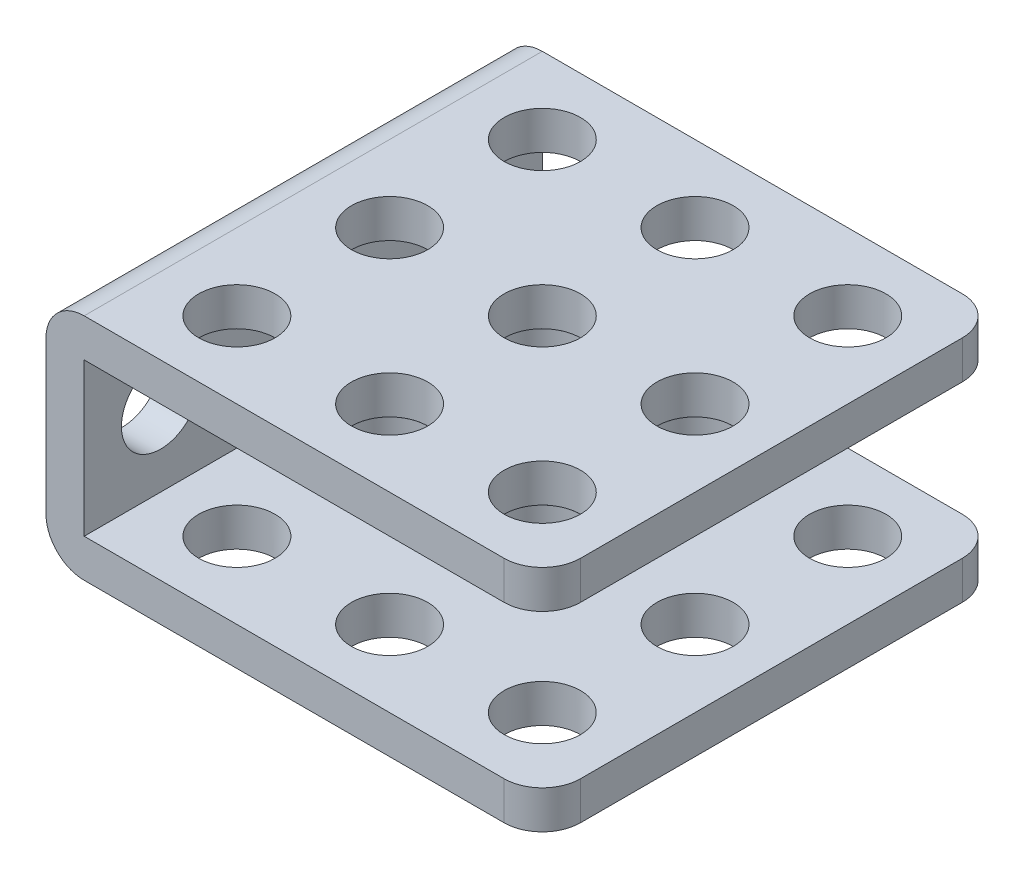
ISO-10303-21;
HEADER;
FILE_DESCRIPTION(('STEP AP214'),'2;1');
FILE_NAME('part.step','',(''),(''),'','','');
FILE_SCHEMA(('AUTOMOTIVE_DESIGN { 1 0 10303 214 1 1 1 1 }'));
ENDSEC;
DATA;
#1=APPLICATION_CONTEXT('core data for automotive mechanical design processes');
#2=APPLICATION_PROTOCOL_DEFINITION('international standard','automotive_design',2000,#1);
#3=PRODUCT_CONTEXT('',#1,'mechanical');
#4=PRODUCT('Part','Part','',(#3));
#5=PRODUCT_RELATED_PRODUCT_CATEGORY('part','',(#4));
#6=PRODUCT_DEFINITION_FORMATION('','',#4);
#7=PRODUCT_DEFINITION_CONTEXT('part definition',#1,'design');
#8=PRODUCT_DEFINITION('design','',#6,#7);
#9=PRODUCT_DEFINITION_SHAPE('','',#8);
#10=(LENGTH_UNIT() NAMED_UNIT(*) SI_UNIT(.MILLI.,.METRE.));
#11=(NAMED_UNIT(*) PLANE_ANGLE_UNIT() SI_UNIT($,.RADIAN.));
#12=(NAMED_UNIT(*) SI_UNIT($,.STERADIAN.) SOLID_ANGLE_UNIT());
#13=UNCERTAINTY_MEASURE_WITH_UNIT(LENGTH_MEASURE(1.E-05),#10,'distance_accuracy_value','');
#14=(GEOMETRIC_REPRESENTATION_CONTEXT(3) GLOBAL_UNCERTAINTY_ASSIGNED_CONTEXT((#13)) GLOBAL_UNIT_ASSIGNED_CONTEXT((#10,
#11,#12)) REPRESENTATION_CONTEXT('',''));
#15=CARTESIAN_POINT('',(0.,0.,0.));
#16=DIRECTION('',(0.,0.,1.));
#17=DIRECTION('',(1.,0.,0.));
#18=AXIS2_PLACEMENT_3D('',#15,#16,#17);
#19=CARTESIAN_POINT('',(6.,0.,20.));
#20=DIRECTION('',(0.,1.,0.));
#21=DIRECTION('',(0.,0.,1.));
#22=AXIS2_PLACEMENT_3D('',#19,#20,#21);
#23=CYLINDRICAL_SURFACE('',#22,2.);
#24=CARTESIAN_POINT('',(6.,12.,20.));
#25=DIRECTION('',(0.,1.,0.));
#26=DIRECTION('',(0.,0.,1.));
#27=AXIS2_PLACEMENT_3D('',#24,#25,#26);
#28=CIRCLE('',#27,2.);
#29=CARTESIAN_POINT('',(6.,12.,22.));
#30=VERTEX_POINT('',#29);
#31=EDGE_CURVE('E280',#30,#30,#28,.T.);
#32=ORIENTED_EDGE('',*,*,#31,.T.);
#33=EDGE_LOOP('',(#32));
#34=FACE_BOUND('',#33,.T.);
#35=CARTESIAN_POINT('',(6.,10.,20.));
#36=DIRECTION('',(0.,1.,0.));
#37=DIRECTION('',(0.,0.,1.));
#38=AXIS2_PLACEMENT_3D('',#35,#36,#37);
#39=CIRCLE('',#38,2.);
#40=CARTESIAN_POINT('',(6.,10.,22.));
#41=VERTEX_POINT('',#40);
#42=EDGE_CURVE('E283',#41,#41,#39,.T.);
#43=ORIENTED_EDGE('',*,*,#42,.F.);
#44=EDGE_LOOP('',(#43));
#45=FACE_BOUND('',#44,.T.);
#46=ADVANCED_FACE('F32',(#34,#45),#23,.F.);
#47=CARTESIAN_POINT('',(6.,0.,12.));
#48=DIRECTION('',(0.,1.,0.));
#49=DIRECTION('',(0.,0.,1.));
#50=AXIS2_PLACEMENT_3D('',#47,#48,#49);
#51=CYLINDRICAL_SURFACE('',#50,2.);
#52=CARTESIAN_POINT('',(6.,12.,12.));
#53=DIRECTION('',(0.,1.,0.));
#54=DIRECTION('',(0.,0.,1.));
#55=AXIS2_PLACEMENT_3D('',#52,#53,#54);
#56=CIRCLE('',#55,2.);
#57=CARTESIAN_POINT('',(6.,12.,14.));
#58=VERTEX_POINT('',#57);
#59=EDGE_CURVE('E274',#58,#58,#56,.T.);
#60=ORIENTED_EDGE('',*,*,#59,.T.);
#61=EDGE_LOOP('',(#60));
#62=FACE_BOUND('',#61,.T.);
#63=CARTESIAN_POINT('',(6.,10.,12.));
#64=DIRECTION('',(0.,1.,0.));
#65=DIRECTION('',(0.,0.,1.));
#66=AXIS2_PLACEMENT_3D('',#63,#64,#65);
#67=CIRCLE('',#66,2.);
#68=CARTESIAN_POINT('',(6.,10.,14.));
#69=VERTEX_POINT('',#68);
#70=EDGE_CURVE('E277',#69,#69,#67,.T.);
#71=ORIENTED_EDGE('',*,*,#70,.F.);
#72=EDGE_LOOP('',(#71));
#73=FACE_BOUND('',#72,.T.);
#74=ADVANCED_FACE('F424',(#62,#73),#51,.F.);
#75=CARTESIAN_POINT('',(6.,0.,4.));
#76=DIRECTION('',(0.,1.,0.));
#77=DIRECTION('',(0.,0.,1.));
#78=AXIS2_PLACEMENT_3D('',#75,#76,#77);
#79=CYLINDRICAL_SURFACE('',#78,2.);
#80=CARTESIAN_POINT('',(6.,12.,4.));
#81=DIRECTION('',(0.,1.,0.));
#82=DIRECTION('',(0.,0.,1.));
#83=AXIS2_PLACEMENT_3D('',#80,#81,#82);
#84=CIRCLE('',#83,2.);
#85=CARTESIAN_POINT('',(6.,12.,6.));
#86=VERTEX_POINT('',#85);
#87=EDGE_CURVE('E268',#86,#86,#84,.T.);
#88=ORIENTED_EDGE('',*,*,#87,.T.);
#89=EDGE_LOOP('',(#88));
#90=FACE_BOUND('',#89,.T.);
#91=CARTESIAN_POINT('',(6.,10.,4.));
#92=DIRECTION('',(0.,1.,0.));
#93=DIRECTION('',(0.,0.,1.));
#94=AXIS2_PLACEMENT_3D('',#91,#92,#93);
#95=CIRCLE('',#94,2.);
#96=CARTESIAN_POINT('',(6.,10.,6.));
#97=VERTEX_POINT('',#96);
#98=EDGE_CURVE('E271',#97,#97,#95,.T.);
#99=ORIENTED_EDGE('',*,*,#98,.F.);
#100=EDGE_LOOP('',(#99));
#101=FACE_BOUND('',#100,.T.);
#102=ADVANCED_FACE('F497',(#90,#101),#79,.F.);
#103=CARTESIAN_POINT('',(14.,0.,20.));
#104=DIRECTION('',(0.,1.,0.));
#105=DIRECTION('',(0.,0.,1.));
#106=AXIS2_PLACEMENT_3D('',#103,#104,#105);
#107=CYLINDRICAL_SURFACE('',#106,2.);
#108=CARTESIAN_POINT('',(14.,12.,20.));
#109=DIRECTION('',(0.,1.,0.));
#110=DIRECTION('',(0.,0.,1.));
#111=AXIS2_PLACEMENT_3D('',#108,#109,#110);
#112=CIRCLE('',#111,2.);
#113=CARTESIAN_POINT('',(14.,12.,22.));
#114=VERTEX_POINT('',#113);
#115=EDGE_CURVE('E262',#114,#114,#112,.T.);
#116=ORIENTED_EDGE('',*,*,#115,.T.);
#117=EDGE_LOOP('',(#116));
#118=FACE_BOUND('',#117,.T.);
#119=CARTESIAN_POINT('',(14.,10.,20.));
#120=DIRECTION('',(0.,1.,0.));
#121=DIRECTION('',(0.,0.,1.));
#122=AXIS2_PLACEMENT_3D('',#119,#120,#121);
#123=CIRCLE('',#122,2.);
#124=CARTESIAN_POINT('',(14.,10.,22.));
#125=VERTEX_POINT('',#124);
#126=EDGE_CURVE('E265',#125,#125,#123,.T.);
#127=ORIENTED_EDGE('',*,*,#126,.F.);
#128=EDGE_LOOP('',(#127));
#129=FACE_BOUND('',#128,.T.);
#130=ADVANCED_FACE('F493',(#118,#129),#107,.F.);
#131=CARTESIAN_POINT('',(14.,0.,12.));
#132=DIRECTION('',(0.,1.,0.));
#133=DIRECTION('',(0.,0.,1.));
#134=AXIS2_PLACEMENT_3D('',#131,#132,#133);
#135=CYLINDRICAL_SURFACE('',#134,2.);
#136=CARTESIAN_POINT('',(14.,12.,12.));
#137=DIRECTION('',(0.,1.,0.));
#138=DIRECTION('',(0.,0.,1.));
#139=AXIS2_PLACEMENT_3D('',#136,#137,#138);
#140=CIRCLE('',#139,2.);
#141=CARTESIAN_POINT('',(14.,12.,14.));
#142=VERTEX_POINT('',#141);
#143=EDGE_CURVE('E256',#142,#142,#140,.T.);
#144=ORIENTED_EDGE('',*,*,#143,.T.);
#145=EDGE_LOOP('',(#144));
#146=FACE_BOUND('',#145,.T.);
#147=CARTESIAN_POINT('',(14.,10.,12.));
#148=DIRECTION('',(0.,1.,0.));
#149=DIRECTION('',(0.,0.,1.));
#150=AXIS2_PLACEMENT_3D('',#147,#148,#149);
#151=CIRCLE('',#150,2.);
#152=CARTESIAN_POINT('',(14.,10.,14.));
#153=VERTEX_POINT('',#152);
#154=EDGE_CURVE('E259',#153,#153,#151,.T.);
#155=ORIENTED_EDGE('',*,*,#154,.F.);
#156=EDGE_LOOP('',(#155));
#157=FACE_BOUND('',#156,.T.);
#158=ADVANCED_FACE('F489',(#146,#157),#135,.F.);
#159=CARTESIAN_POINT('',(14.,0.,4.));
#160=DIRECTION('',(0.,1.,0.));
#161=DIRECTION('',(0.,0.,1.));
#162=AXIS2_PLACEMENT_3D('',#159,#160,#161);
#163=CYLINDRICAL_SURFACE('',#162,2.);
#164=CARTESIAN_POINT('',(14.,12.,4.));
#165=DIRECTION('',(0.,1.,0.));
#166=DIRECTION('',(0.,0.,1.));
#167=AXIS2_PLACEMENT_3D('',#164,#165,#166);
#168=CIRCLE('',#167,2.);
#169=CARTESIAN_POINT('',(14.,12.,6.));
#170=VERTEX_POINT('',#169);
#171=EDGE_CURVE('E250',#170,#170,#168,.T.);
#172=ORIENTED_EDGE('',*,*,#171,.T.);
#173=EDGE_LOOP('',(#172));
#174=FACE_BOUND('',#173,.T.);
#175=CARTESIAN_POINT('',(14.,10.,4.));
#176=DIRECTION('',(0.,1.,0.));
#177=DIRECTION('',(0.,0.,1.));
#178=AXIS2_PLACEMENT_3D('',#175,#176,#177);
#179=CIRCLE('',#178,2.);
#180=CARTESIAN_POINT('',(14.,10.,6.));
#181=VERTEX_POINT('',#180);
#182=EDGE_CURVE('E253',#181,#181,#179,.T.);
#183=ORIENTED_EDGE('',*,*,#182,.F.);
#184=EDGE_LOOP('',(#183));
#185=FACE_BOUND('',#184,.T.);
#186=ADVANCED_FACE('F485',(#174,#185),#163,.F.);
#187=CARTESIAN_POINT('',(22.,0.,20.));
#188=DIRECTION('',(0.,1.,0.));
#189=DIRECTION('',(0.,0.,1.));
#190=AXIS2_PLACEMENT_3D('',#187,#188,#189);
#191=CYLINDRICAL_SURFACE('',#190,2.);
#192=CARTESIAN_POINT('',(22.,12.,20.));
#193=DIRECTION('',(0.,1.,0.));
#194=DIRECTION('',(0.,0.,1.));
#195=AXIS2_PLACEMENT_3D('',#192,#193,#194);
#196=CIRCLE('',#195,2.);
#197=CARTESIAN_POINT('',(22.,12.,22.));
#198=VERTEX_POINT('',#197);
#199=EDGE_CURVE('E244',#198,#198,#196,.T.);
#200=ORIENTED_EDGE('',*,*,#199,.T.);
#201=EDGE_LOOP('',(#200));
#202=FACE_BOUND('',#201,.T.);
#203=CARTESIAN_POINT('',(22.,10.,20.));
#204=DIRECTION('',(0.,1.,0.));
#205=DIRECTION('',(0.,0.,1.));
#206=AXIS2_PLACEMENT_3D('',#203,#204,#205);
#207=CIRCLE('',#206,2.);
#208=CARTESIAN_POINT('',(22.,10.,22.));
#209=VERTEX_POINT('',#208);
#210=EDGE_CURVE('E247',#209,#209,#207,.T.);
#211=ORIENTED_EDGE('',*,*,#210,.F.);
#212=EDGE_LOOP('',(#211));
#213=FACE_BOUND('',#212,.T.);
#214=ADVANCED_FACE('F481',(#202,#213),#191,.F.);
#215=CARTESIAN_POINT('',(6.,0.,20.));
#216=DIRECTION('',(0.,1.,0.));
#217=DIRECTION('',(0.,0.,1.));
#218=AXIS2_PLACEMENT_3D('',#215,#216,#217);
#219=CYLINDRICAL_SURFACE('',#218,2.);
#220=CARTESIAN_POINT('',(6.,0.,20.));
#221=DIRECTION('',(0.,1.,0.));
#222=DIRECTION('',(0.,0.,1.));
#223=AXIS2_PLACEMENT_3D('',#220,#221,#222);
#224=CIRCLE('',#223,2.);
#225=CARTESIAN_POINT('',(6.,0.,22.));
#226=VERTEX_POINT('',#225);
#227=EDGE_CURVE('E238',#226,#226,#224,.T.);
#228=ORIENTED_EDGE('',*,*,#227,.F.);
#229=EDGE_LOOP('',(#228));
#230=FACE_BOUND('',#229,.T.);
#231=CARTESIAN_POINT('',(6.,2.,20.));
#232=DIRECTION('',(0.,-1.,0.));
#233=DIRECTION('',(0.,0.,-1.));
#234=AXIS2_PLACEMENT_3D('',#231,#232,#233);
#235=CIRCLE('',#234,2.);
#236=CARTESIAN_POINT('',(6.,2.,18.));
#237=VERTEX_POINT('',#236);
#238=EDGE_CURVE('E241',#237,#237,#235,.T.);
#239=ORIENTED_EDGE('',*,*,#238,.F.);
#240=EDGE_LOOP('',(#239));
#241=FACE_BOUND('',#240,.T.);
#242=ADVANCED_FACE('F477',(#230,#241),#219,.F.);
#243=CARTESIAN_POINT('',(6.,0.,12.));
#244=DIRECTION('',(0.,1.,0.));
#245=DIRECTION('',(0.,0.,1.));
#246=AXIS2_PLACEMENT_3D('',#243,#244,#245);
#247=CYLINDRICAL_SURFACE('',#246,2.);
#248=CARTESIAN_POINT('',(6.,0.,12.));
#249=DIRECTION('',(0.,1.,0.));
#250=DIRECTION('',(0.,0.,1.));
#251=AXIS2_PLACEMENT_3D('',#248,#249,#250);
#252=CIRCLE('',#251,2.);
#253=CARTESIAN_POINT('',(6.,0.,14.));
#254=VERTEX_POINT('',#253);
#255=EDGE_CURVE('E232',#254,#254,#252,.T.);
#256=ORIENTED_EDGE('',*,*,#255,.F.);
#257=EDGE_LOOP('',(#256));
#258=FACE_BOUND('',#257,.T.);
#259=CARTESIAN_POINT('',(6.,2.,12.));
#260=DIRECTION('',(0.,-1.,0.));
#261=DIRECTION('',(0.,0.,-1.));
#262=AXIS2_PLACEMENT_3D('',#259,#260,#261);
#263=CIRCLE('',#262,2.);
#264=CARTESIAN_POINT('',(6.,2.,10.));
#265=VERTEX_POINT('',#264);
#266=EDGE_CURVE('E235',#265,#265,#263,.T.);
#267=ORIENTED_EDGE('',*,*,#266,.F.);
#268=EDGE_LOOP('',(#267));
#269=FACE_BOUND('',#268,.T.);
#270=ADVANCED_FACE('F473',(#258,#269),#247,.F.);
#271=CARTESIAN_POINT('',(6.,0.,4.));
#272=DIRECTION('',(0.,1.,0.));
#273=DIRECTION('',(0.,0.,1.));
#274=AXIS2_PLACEMENT_3D('',#271,#272,#273);
#275=CYLINDRICAL_SURFACE('',#274,2.);
#276=CARTESIAN_POINT('',(6.,0.,4.));
#277=DIRECTION('',(0.,1.,0.));
#278=DIRECTION('',(0.,0.,1.));
#279=AXIS2_PLACEMENT_3D('',#276,#277,#278);
#280=CIRCLE('',#279,2.);
#281=CARTESIAN_POINT('',(6.,0.,6.));
#282=VERTEX_POINT('',#281);
#283=EDGE_CURVE('E226',#282,#282,#280,.T.);
#284=ORIENTED_EDGE('',*,*,#283,.F.);
#285=EDGE_LOOP('',(#284));
#286=FACE_BOUND('',#285,.T.);
#287=CARTESIAN_POINT('',(6.,2.,4.));
#288=DIRECTION('',(0.,-1.,0.));
#289=DIRECTION('',(0.,0.,-1.));
#290=AXIS2_PLACEMENT_3D('',#287,#288,#289);
#291=CIRCLE('',#290,2.);
#292=CARTESIAN_POINT('',(6.,2.,2.));
#293=VERTEX_POINT('',#292);
#294=EDGE_CURVE('E229',#293,#293,#291,.T.);
#295=ORIENTED_EDGE('',*,*,#294,.F.);
#296=EDGE_LOOP('',(#295));
#297=FACE_BOUND('',#296,.T.);
#298=ADVANCED_FACE('F469',(#286,#297),#275,.F.);
#299=CARTESIAN_POINT('',(14.,0.,20.));
#300=DIRECTION('',(0.,1.,0.));
#301=DIRECTION('',(0.,0.,1.));
#302=AXIS2_PLACEMENT_3D('',#299,#300,#301);
#303=CYLINDRICAL_SURFACE('',#302,2.);
#304=CARTESIAN_POINT('',(14.,0.,20.));
#305=DIRECTION('',(0.,1.,0.));
#306=DIRECTION('',(0.,0.,1.));
#307=AXIS2_PLACEMENT_3D('',#304,#305,#306);
#308=CIRCLE('',#307,2.);
#309=CARTESIAN_POINT('',(14.,0.,22.));
#310=VERTEX_POINT('',#309);
#311=EDGE_CURVE('E220',#310,#310,#308,.T.);
#312=ORIENTED_EDGE('',*,*,#311,.F.);
#313=EDGE_LOOP('',(#312));
#314=FACE_BOUND('',#313,.T.);
#315=CARTESIAN_POINT('',(14.,2.,20.));
#316=DIRECTION('',(0.,-1.,0.));
#317=DIRECTION('',(0.,0.,-1.));
#318=AXIS2_PLACEMENT_3D('',#315,#316,#317);
#319=CIRCLE('',#318,2.);
#320=CARTESIAN_POINT('',(14.,2.,18.));
#321=VERTEX_POINT('',#320);
#322=EDGE_CURVE('E223',#321,#321,#319,.T.);
#323=ORIENTED_EDGE('',*,*,#322,.F.);
#324=EDGE_LOOP('',(#323));
#325=FACE_BOUND('',#324,.T.);
#326=ADVANCED_FACE('F465',(#314,#325),#303,.F.);
#327=CARTESIAN_POINT('',(14.,0.,12.));
#328=DIRECTION('',(0.,1.,0.));
#329=DIRECTION('',(0.,0.,1.));
#330=AXIS2_PLACEMENT_3D('',#327,#328,#329);
#331=CYLINDRICAL_SURFACE('',#330,2.);
#332=CARTESIAN_POINT('',(14.,0.,12.));
#333=DIRECTION('',(0.,1.,0.));
#334=DIRECTION('',(0.,0.,1.));
#335=AXIS2_PLACEMENT_3D('',#332,#333,#334);
#336=CIRCLE('',#335,2.);
#337=CARTESIAN_POINT('',(14.,0.,14.));
#338=VERTEX_POINT('',#337);
#339=EDGE_CURVE('E214',#338,#338,#336,.T.);
#340=ORIENTED_EDGE('',*,*,#339,.F.);
#341=EDGE_LOOP('',(#340));
#342=FACE_BOUND('',#341,.T.);
#343=CARTESIAN_POINT('',(14.,2.,12.));
#344=DIRECTION('',(0.,-1.,0.));
#345=DIRECTION('',(0.,0.,-1.));
#346=AXIS2_PLACEMENT_3D('',#343,#344,#345);
#347=CIRCLE('',#346,2.);
#348=CARTESIAN_POINT('',(14.,2.,10.));
#349=VERTEX_POINT('',#348);
#350=EDGE_CURVE('E217',#349,#349,#347,.T.);
#351=ORIENTED_EDGE('',*,*,#350,.F.);
#352=EDGE_LOOP('',(#351));
#353=FACE_BOUND('',#352,.T.);
#354=ADVANCED_FACE('F461',(#342,#353),#331,.F.);
#355=CARTESIAN_POINT('',(14.,0.,4.));
#356=DIRECTION('',(0.,1.,0.));
#357=DIRECTION('',(0.,0.,1.));
#358=AXIS2_PLACEMENT_3D('',#355,#356,#357);
#359=CYLINDRICAL_SURFACE('',#358,2.);
#360=CARTESIAN_POINT('',(14.,0.,4.));
#361=DIRECTION('',(0.,1.,0.));
#362=DIRECTION('',(0.,0.,1.));
#363=AXIS2_PLACEMENT_3D('',#360,#361,#362);
#364=CIRCLE('',#363,2.);
#365=CARTESIAN_POINT('',(14.,0.,6.));
#366=VERTEX_POINT('',#365);
#367=EDGE_CURVE('E208',#366,#366,#364,.T.);
#368=ORIENTED_EDGE('',*,*,#367,.F.);
#369=EDGE_LOOP('',(#368));
#370=FACE_BOUND('',#369,.T.);
#371=CARTESIAN_POINT('',(14.,2.,4.));
#372=DIRECTION('',(0.,-1.,0.));
#373=DIRECTION('',(0.,0.,-1.));
#374=AXIS2_PLACEMENT_3D('',#371,#372,#373);
#375=CIRCLE('',#374,2.);
#376=CARTESIAN_POINT('',(14.,2.,2.));
#377=VERTEX_POINT('',#376);
#378=EDGE_CURVE('E211',#377,#377,#375,.T.);
#379=ORIENTED_EDGE('',*,*,#378,.F.);
#380=EDGE_LOOP('',(#379));
#381=FACE_BOUND('',#380,.T.);
#382=ADVANCED_FACE('F457',(#370,#381),#359,.F.);
#383=CARTESIAN_POINT('',(22.,0.,20.));
#384=DIRECTION('',(0.,1.,0.));
#385=DIRECTION('',(0.,0.,1.));
#386=AXIS2_PLACEMENT_3D('',#383,#384,#385);
#387=CYLINDRICAL_SURFACE('',#386,2.);
#388=CARTESIAN_POINT('',(22.,0.,20.));
#389=DIRECTION('',(0.,1.,0.));
#390=DIRECTION('',(0.,0.,1.));
#391=AXIS2_PLACEMENT_3D('',#388,#389,#390);
#392=CIRCLE('',#391,2.);
#393=CARTESIAN_POINT('',(22.,0.,22.));
#394=VERTEX_POINT('',#393);
#395=EDGE_CURVE('E202',#394,#394,#392,.T.);
#396=ORIENTED_EDGE('',*,*,#395,.F.);
#397=EDGE_LOOP('',(#396));
#398=FACE_BOUND('',#397,.T.);
#399=CARTESIAN_POINT('',(22.,2.,20.));
#400=DIRECTION('',(0.,-1.,0.));
#401=DIRECTION('',(0.,0.,-1.));
#402=AXIS2_PLACEMENT_3D('',#399,#400,#401);
#403=CIRCLE('',#402,2.);
#404=CARTESIAN_POINT('',(22.,2.,18.));
#405=VERTEX_POINT('',#404);
#406=EDGE_CURVE('E205',#405,#405,#403,.T.);
#407=ORIENTED_EDGE('',*,*,#406,.F.);
#408=EDGE_LOOP('',(#407));
#409=FACE_BOUND('',#408,.T.);
#410=ADVANCED_FACE('F453',(#398,#409),#387,.F.);
#411=CARTESIAN_POINT('',(0.,6.,4.));
#412=DIRECTION('',(1.,0.,0.));
#413=DIRECTION('',(0.,1.,0.));
#414=AXIS2_PLACEMENT_3D('',#411,#412,#413);
#415=CYLINDRICAL_SURFACE('',#414,2.05);
#416=CARTESIAN_POINT('',(0.,6.,4.));
#417=DIRECTION('',(1.,0.,0.));
#418=DIRECTION('',(0.,1.,0.));
#419=AXIS2_PLACEMENT_3D('',#416,#417,#418);
#420=CIRCLE('',#419,2.05);
#421=CARTESIAN_POINT('',(0.,8.05,4.));
#422=VERTEX_POINT('',#421);
#423=EDGE_CURVE('E196',#422,#422,#420,.T.);
#424=ORIENTED_EDGE('',*,*,#423,.F.);
#425=EDGE_LOOP('',(#424));
#426=FACE_BOUND('',#425,.T.);
#427=CARTESIAN_POINT('',(2.,6.,4.));
#428=DIRECTION('',(1.,0.,0.));
#429=DIRECTION('',(0.,1.,0.));
#430=AXIS2_PLACEMENT_3D('',#427,#428,#429);
#431=CIRCLE('',#430,2.05);
#432=CARTESIAN_POINT('',(2.,8.05,4.));
#433=VERTEX_POINT('',#432);
#434=EDGE_CURVE('E199',#433,#433,#431,.T.);
#435=ORIENTED_EDGE('',*,*,#434,.T.);
#436=EDGE_LOOP('',(#435));
#437=FACE_BOUND('',#436,.T.);
#438=ADVANCED_FACE('F449',(#426,#437),#415,.F.);
#439=CARTESIAN_POINT('',(26.,0.,24.));
#440=DIRECTION('',(0.,1.,0.));
#441=DIRECTION('',(-1.,0.,0.));
#442=AXIS2_PLACEMENT_3D('',#439,#440,#441);
#443=PLANE('',#442);
#444=CARTESIAN_POINT('',(22.,0.,12.));
#445=DIRECTION('',(0.,1.,0.));
#446=DIRECTION('',(0.,0.,1.));
#447=AXIS2_PLACEMENT_3D('',#444,#445,#446);
#448=CIRCLE('',#447,2.);
#449=CARTESIAN_POINT('',(22.,0.,14.));
#450=VERTEX_POINT('',#449);
#451=EDGE_CURVE('E385',#450,#450,#448,.T.);
#452=ORIENTED_EDGE('',*,*,#451,.T.);
#453=EDGE_LOOP('',(#452));
#454=FACE_BOUND('',#453,.T.);
#455=CARTESIAN_POINT('',(22.,0.,4.));
#456=DIRECTION('',(0.,1.,0.));
#457=DIRECTION('',(0.,0.,1.));
#458=AXIS2_PLACEMENT_3D('',#455,#456,#457);
#459=CIRCLE('',#458,2.);
#460=CARTESIAN_POINT('',(22.,0.,6.));
#461=VERTEX_POINT('',#460);
#462=EDGE_CURVE('E376',#461,#461,#459,.T.);
#463=ORIENTED_EDGE('',*,*,#462,.T.);
#464=EDGE_LOOP('',(#463));
#465=FACE_BOUND('',#464,.T.);
#466=DIRECTION('',(1.,0.,0.));
#467=VECTOR('',#466,1.);
#468=CARTESIAN_POINT('',(26.,0.,24.));
#469=LINE('',#468,#467);
#470=CARTESIAN_POINT('',(2.00000000000001,0.,24.));
#471=VERTEX_POINT('',#470);
#472=CARTESIAN_POINT('',(24.,0.,24.));
#473=VERTEX_POINT('',#472);
#474=EDGE_CURVE('E142',#471,#473,#469,.T.);
#475=ORIENTED_EDGE('',*,*,#474,.F.);
#476=DIRECTION('',(0.,0.,-1.));
#477=VECTOR('',#476,1.);
#478=CARTESIAN_POINT('',(2.,0.,24.));
#479=LINE('',#478,#477);
#480=CARTESIAN_POINT('',(2.00000000000001,0.,0.));
#481=VERTEX_POINT('',#480);
#482=EDGE_CURVE('E290',#471,#481,#479,.T.);
#483=ORIENTED_EDGE('',*,*,#482,.T.);
#484=DIRECTION('',(1.,0.,0.));
#485=VECTOR('',#484,1.);
#486=CARTESIAN_POINT('',(26.,0.,0.));
#487=LINE('',#486,#485);
#488=CARTESIAN_POINT('',(24.,0.,0.));
#489=VERTEX_POINT('',#488);
#490=EDGE_CURVE('E170',#481,#489,#487,.T.);
#491=ORIENTED_EDGE('',*,*,#490,.T.);
#492=CARTESIAN_POINT('',(24.,0.,2.));
#493=DIRECTION('',(0.,1.,0.));
#494=DIRECTION('',(-1.,0.,0.));
#495=AXIS2_PLACEMENT_3D('',#492,#493,#494);
#496=CIRCLE('',#495,2.);
#497=CARTESIAN_POINT('',(26.,0.,2.));
#498=VERTEX_POINT('',#497);
#499=EDGE_CURVE('E288',#489,#498,#496,.F.);
#500=ORIENTED_EDGE('',*,*,#499,.T.);
#501=DIRECTION('',(0.,0.,-1.));
#502=VECTOR('',#501,1.);
#503=CARTESIAN_POINT('',(26.,0.,24.));
#504=LINE('',#503,#502);
#505=CARTESIAN_POINT('',(26.,0.,22.));
#506=VERTEX_POINT('',#505);
#507=EDGE_CURVE('E193',#506,#498,#504,.T.);
#508=ORIENTED_EDGE('',*,*,#507,.F.);
#509=CARTESIAN_POINT('',(24.,0.,22.));
#510=DIRECTION('',(0.,1.,0.));
#511=DIRECTION('',(-1.,0.,0.));
#512=AXIS2_PLACEMENT_3D('',#509,#510,#511);
#513=CIRCLE('',#512,2.);
#514=EDGE_CURVE('E286',#506,#473,#513,.F.);
#515=ORIENTED_EDGE('',*,*,#514,.T.);
#516=EDGE_LOOP('',(#475,#483,#491,#500,#508,#515));
#517=FACE_BOUND('',#516,.T.);
#518=ORIENTED_EDGE('',*,*,#395,.T.);
#519=EDGE_LOOP('',(#518));
#520=FACE_BOUND('',#519,.T.);
#521=ORIENTED_EDGE('',*,*,#367,.T.);
#522=EDGE_LOOP('',(#521));
#523=FACE_BOUND('',#522,.T.);
#524=ORIENTED_EDGE('',*,*,#339,.T.);
#525=EDGE_LOOP('',(#524));
#526=FACE_BOUND('',#525,.T.);
#527=ORIENTED_EDGE('',*,*,#311,.T.);
#528=EDGE_LOOP('',(#527));
#529=FACE_BOUND('',#528,.T.);
#530=ORIENTED_EDGE('',*,*,#283,.T.);
#531=EDGE_LOOP('',(#530));
#532=FACE_BOUND('',#531,.T.);
#533=ORIENTED_EDGE('',*,*,#255,.T.);
#534=EDGE_LOOP('',(#533));
#535=FACE_BOUND('',#534,.T.);
#536=ORIENTED_EDGE('',*,*,#227,.T.);
#537=EDGE_LOOP('',(#536));
#538=FACE_BOUND('',#537,.T.);
#539=ADVANCED_FACE('F344',(#454,#465,#517,#520,#523,#526,#529,#532,#535,#538),#443,.F.);
#540=CARTESIAN_POINT('',(26.,2.,24.));
#541=DIRECTION('',(-1.,0.,0.));
#542=DIRECTION('',(0.,0.,1.));
#543=AXIS2_PLACEMENT_3D('',#540,#541,#542);
#544=PLANE('',#543);
#545=ORIENTED_EDGE('',*,*,#507,.T.);
#546=DIRECTION('',(0.,1.,0.));
#547=VECTOR('',#546,1.);
#548=CARTESIAN_POINT('',(26.,2.,2.));
#549=LINE('',#548,#547);
#550=CARTESIAN_POINT('',(26.,2.,2.));
#551=VERTEX_POINT('',#550);
#552=EDGE_CURVE('E331',#498,#551,#549,.T.);
#553=ORIENTED_EDGE('',*,*,#552,.T.);
#554=DIRECTION('',(0.,0.,-1.));
#555=VECTOR('',#554,1.);
#556=CARTESIAN_POINT('',(26.,2.,24.));
#557=LINE('',#556,#555);
#558=CARTESIAN_POINT('',(26.,2.,22.));
#559=VERTEX_POINT('',#558);
#560=EDGE_CURVE('E152',#559,#551,#557,.T.);
#561=ORIENTED_EDGE('',*,*,#560,.F.);
#562=DIRECTION('',(0.,1.,0.));
#563=VECTOR('',#562,1.);
#564=CARTESIAN_POINT('',(26.,2.,22.));
#565=LINE('',#564,#563);
#566=EDGE_CURVE('E329',#559,#506,#565,.F.);
#567=ORIENTED_EDGE('',*,*,#566,.T.);
#568=EDGE_LOOP('',(#545,#553,#561,#567));
#569=FACE_BOUND('',#568,.T.);
#570=ADVANCED_FACE('F333',(#569),#544,.F.);
#571=CARTESIAN_POINT('',(2.,2.,24.));
#572=DIRECTION('',(0.,-1.,0.));
#573=DIRECTION('',(0.,0.,-1.));
#574=AXIS2_PLACEMENT_3D('',#571,#572,#573);
#575=PLANE('',#574);
#576=CARTESIAN_POINT('',(22.,2.,12.));
#577=DIRECTION('',(0.,-1.,0.));
#578=DIRECTION('',(0.,0.,-1.));
#579=AXIS2_PLACEMENT_3D('',#576,#577,#578);
#580=CIRCLE('',#579,2.);
#581=CARTESIAN_POINT('',(22.,2.,10.));
#582=VERTEX_POINT('',#581);
#583=EDGE_CURVE('E382',#582,#582,#580,.T.);
#584=ORIENTED_EDGE('',*,*,#583,.T.);
#585=EDGE_LOOP('',(#584));
#586=FACE_BOUND('',#585,.T.);
#587=CARTESIAN_POINT('',(22.,2.,4.));
#588=DIRECTION('',(0.,-1.,0.));
#589=DIRECTION('',(0.,0.,-1.));
#590=AXIS2_PLACEMENT_3D('',#587,#588,#589);
#591=CIRCLE('',#590,2.);
#592=CARTESIAN_POINT('',(22.,2.,2.));
#593=VERTEX_POINT('',#592);
#594=EDGE_CURVE('E370',#593,#593,#591,.T.);
#595=ORIENTED_EDGE('',*,*,#594,.T.);
#596=EDGE_LOOP('',(#595));
#597=FACE_BOUND('',#596,.T.);
#598=ORIENTED_EDGE('',*,*,#560,.T.);
#599=CARTESIAN_POINT('',(24.,2.,2.));
#600=DIRECTION('',(0.,-1.,0.));
#601=DIRECTION('',(0.,0.,-1.));
#602=AXIS2_PLACEMENT_3D('',#599,#600,#601);
#603=CIRCLE('',#602,2.);
#604=CARTESIAN_POINT('',(24.,2.,0.));
#605=VERTEX_POINT('',#604);
#606=EDGE_CURVE('E11',#551,#605,#603,.F.);
#607=ORIENTED_EDGE('',*,*,#606,.T.);
#608=DIRECTION('',(-1.,0.,0.));
#609=VECTOR('',#608,1.);
#610=CARTESIAN_POINT('',(2.,2.,0.));
#611=LINE('',#610,#609);
#612=CARTESIAN_POINT('',(2.,2.,0.));
#613=VERTEX_POINT('',#612);
#614=EDGE_CURVE('E149',#605,#613,#611,.T.);
#615=ORIENTED_EDGE('',*,*,#614,.T.);
#616=DIRECTION('',(0.,0.,-1.));
#617=VECTOR('',#616,1.);
#618=CARTESIAN_POINT('',(2.,2.,24.));
#619=LINE('',#618,#617);
#620=CARTESIAN_POINT('',(2.,2.,24.));
#621=VERTEX_POINT('',#620);
#622=EDGE_CURVE('E145',#621,#613,#619,.T.);
#623=ORIENTED_EDGE('',*,*,#622,.F.);
#624=DIRECTION('',(-1.,0.,0.));
#625=VECTOR('',#624,1.);
#626=CARTESIAN_POINT('',(2.,2.,24.));
#627=LINE('',#626,#625);
#628=CARTESIAN_POINT('',(24.,2.,24.));
#629=VERTEX_POINT('',#628);
#630=EDGE_CURVE('E131',#629,#621,#627,.T.);
#631=ORIENTED_EDGE('',*,*,#630,.F.);
#632=CARTESIAN_POINT('',(24.,2.,22.));
#633=DIRECTION('',(0.,-1.,0.));
#634=DIRECTION('',(0.,0.,-1.));
#635=AXIS2_PLACEMENT_3D('',#632,#633,#634);
#636=CIRCLE('',#635,2.);
#637=EDGE_CURVE('E40',#629,#559,#636,.F.);
#638=ORIENTED_EDGE('',*,*,#637,.T.);
#639=EDGE_LOOP('',(#598,#607,#615,#623,#631,#638));
#640=FACE_BOUND('',#639,.T.);
#641=ORIENTED_EDGE('',*,*,#406,.T.);
#642=EDGE_LOOP('',(#641));
#643=FACE_BOUND('',#642,.T.);
#644=ORIENTED_EDGE('',*,*,#378,.T.);
#645=EDGE_LOOP('',(#644));
#646=FACE_BOUND('',#645,.T.);
#647=ORIENTED_EDGE('',*,*,#350,.T.);
#648=EDGE_LOOP('',(#647));
#649=FACE_BOUND('',#648,.T.);
#650=ORIENTED_EDGE('',*,*,#322,.T.);
#651=EDGE_LOOP('',(#650));
#652=FACE_BOUND('',#651,.T.);
#653=ORIENTED_EDGE('',*,*,#294,.T.);
#654=EDGE_LOOP('',(#653));
#655=FACE_BOUND('',#654,.T.);
#656=ORIENTED_EDGE('',*,*,#266,.T.);
#657=EDGE_LOOP('',(#656));
#658=FACE_BOUND('',#657,.T.);
#659=ORIENTED_EDGE('',*,*,#238,.T.);
#660=EDGE_LOOP('',(#659));
#661=FACE_BOUND('',#660,.T.);
#662=ADVANCED_FACE('F146',(#586,#597,#640,#643,#646,#649,#652,#655,#658,#661),#575,.F.);
#663=CARTESIAN_POINT('',(2.,10.,24.));
#664=DIRECTION('',(-1.,0.,0.));
#665=DIRECTION('',(0.,-1.,0.));
#666=AXIS2_PLACEMENT_3D('',#663,#664,#665);
#667=PLANE('',#666);
#668=CARTESIAN_POINT('',(2.,6.,12.));
#669=DIRECTION('',(1.,0.,0.));
#670=DIRECTION('',(0.,1.,0.));
#671=AXIS2_PLACEMENT_3D('',#668,#669,#670);
#672=CIRCLE('',#671,2.05);
#673=CARTESIAN_POINT('',(2.,8.05,12.));
#674=VERTEX_POINT('',#673);
#675=EDGE_CURVE('E362',#674,#674,#672,.T.);
#676=ORIENTED_EDGE('',*,*,#675,.F.);
#677=EDGE_LOOP('',(#676));
#678=FACE_BOUND('',#677,.T.);
#679=CARTESIAN_POINT('',(2.,6.,20.));
#680=DIRECTION('',(1.,0.,0.));
#681=DIRECTION('',(0.,1.,0.));
#682=AXIS2_PLACEMENT_3D('',#679,#680,#681);
#683=CIRCLE('',#682,2.05);
#684=CARTESIAN_POINT('',(2.,8.05,20.));
#685=VERTEX_POINT('',#684);
#686=EDGE_CURVE('E359',#685,#685,#683,.T.);
#687=ORIENTED_EDGE('',*,*,#686,.F.);
#688=EDGE_LOOP('',(#687));
#689=FACE_BOUND('',#688,.T.);
#690=DIRECTION('',(0.,1.,0.));
#691=VECTOR('',#690,1.);
#692=CARTESIAN_POINT('',(2.,10.,0.));
#693=LINE('',#692,#691);
#694=CARTESIAN_POINT('',(2.,10.,0.));
#695=VERTEX_POINT('',#694);
#696=EDGE_CURVE('E175',#613,#695,#693,.T.);
#697=ORIENTED_EDGE('',*,*,#696,.T.);
#698=DIRECTION('',(0.,0.,-1.));
#699=VECTOR('',#698,1.);
#700=CARTESIAN_POINT('',(2.,10.,24.));
#701=LINE('',#700,#699);
#702=CARTESIAN_POINT('',(2.,10.,24.));
#703=VERTEX_POINT('',#702);
#704=EDGE_CURVE('E153',#703,#695,#701,.T.);
#705=ORIENTED_EDGE('',*,*,#704,.F.);
#706=DIRECTION('',(0.,1.,0.));
#707=VECTOR('',#706,1.);
#708=CARTESIAN_POINT('',(2.,10.,24.));
#709=LINE('',#708,#707);
#710=EDGE_CURVE('E137',#621,#703,#709,.T.);
#711=ORIENTED_EDGE('',*,*,#710,.F.);
#712=ORIENTED_EDGE('',*,*,#622,.T.);
#713=EDGE_LOOP('',(#697,#705,#711,#712));
#714=FACE_BOUND('',#713,.T.);
#715=ORIENTED_EDGE('',*,*,#434,.F.);
#716=EDGE_LOOP('',(#715));
#717=FACE_BOUND('',#716,.T.);
#718=ADVANCED_FACE('F155',(#678,#689,#714,#717),#667,.F.);
#719=CARTESIAN_POINT('',(2.,10.,24.));
#720=DIRECTION('',(0.,1.,0.));
#721=DIRECTION('',(0.,0.,1.));
#722=AXIS2_PLACEMENT_3D('',#719,#720,#721);
#723=PLANE('',#722);
#724=CARTESIAN_POINT('',(22.,10.,12.));
#725=DIRECTION('',(0.,1.,0.));
#726=DIRECTION('',(0.,0.,1.));
#727=AXIS2_PLACEMENT_3D('',#724,#725,#726);
#728=CIRCLE('',#727,2.);
#729=CARTESIAN_POINT('',(22.,10.,14.));
#730=VERTEX_POINT('',#729);
#731=EDGE_CURVE('E388',#730,#730,#728,.T.);
#732=ORIENTED_EDGE('',*,*,#731,.T.);
#733=EDGE_LOOP('',(#732));
#734=FACE_BOUND('',#733,.T.);
#735=CARTESIAN_POINT('',(22.,10.,4.));
#736=DIRECTION('',(0.,1.,0.));
#737=DIRECTION('',(0.,0.,1.));
#738=AXIS2_PLACEMENT_3D('',#735,#736,#737);
#739=CIRCLE('',#738,2.);
#740=CARTESIAN_POINT('',(22.,10.,6.));
#741=VERTEX_POINT('',#740);
#742=EDGE_CURVE('E373',#741,#741,#739,.T.);
#743=ORIENTED_EDGE('',*,*,#742,.T.);
#744=EDGE_LOOP('',(#743));
#745=FACE_BOUND('',#744,.T.);
#746=DIRECTION('',(0.,0.,-1.));
#747=VECTOR('',#746,1.);
#748=CARTESIAN_POINT('',(26.,10.,24.));
#749=LINE('',#748,#747);
#750=CARTESIAN_POINT('',(26.,10.,22.));
#751=VERTEX_POINT('',#750);
#752=CARTESIAN_POINT('',(26.,10.,2.));
#753=VERTEX_POINT('',#752);
#754=EDGE_CURVE('E188',#751,#753,#749,.T.);
#755=ORIENTED_EDGE('',*,*,#754,.F.);
#756=CARTESIAN_POINT('',(24.,10.,22.));
#757=DIRECTION('',(0.,1.,0.));
#758=DIRECTION('',(0.,0.,1.));
#759=AXIS2_PLACEMENT_3D('',#756,#757,#758);
#760=CIRCLE('',#759,2.);
#761=CARTESIAN_POINT('',(24.,10.,24.));
#762=VERTEX_POINT('',#761);
#763=EDGE_CURVE('E327',#751,#762,#760,.F.);
#764=ORIENTED_EDGE('',*,*,#763,.T.);
#765=DIRECTION('',(1.,0.,0.));
#766=VECTOR('',#765,1.);
#767=CARTESIAN_POINT('',(2.,10.,24.));
#768=LINE('',#767,#766);
#769=EDGE_CURVE('E159',#703,#762,#768,.T.);
#770=ORIENTED_EDGE('',*,*,#769,.F.);
#771=ORIENTED_EDGE('',*,*,#704,.T.);
#772=DIRECTION('',(1.,0.,0.));
#773=VECTOR('',#772,1.);
#774=CARTESIAN_POINT('',(2.,10.,0.));
#775=LINE('',#774,#773);
#776=CARTESIAN_POINT('',(24.,10.,0.));
#777=VERTEX_POINT('',#776);
#778=EDGE_CURVE('E177',#695,#777,#775,.T.);
#779=ORIENTED_EDGE('',*,*,#778,.T.);
#780=CARTESIAN_POINT('',(24.,10.,2.));
#781=DIRECTION('',(0.,1.,0.));
#782=DIRECTION('',(0.,0.,1.));
#783=AXIS2_PLACEMENT_3D('',#780,#781,#782);
#784=CIRCLE('',#783,2.);
#785=EDGE_CURVE('E325',#777,#753,#784,.F.);
#786=ORIENTED_EDGE('',*,*,#785,.T.);
#787=EDGE_LOOP('',(#755,#764,#770,#771,#779,#786));
#788=FACE_BOUND('',#787,.T.);
#789=ORIENTED_EDGE('',*,*,#210,.T.);
#790=EDGE_LOOP('',(#789));
#791=FACE_BOUND('',#790,.T.);
#792=ORIENTED_EDGE('',*,*,#182,.T.);
#793=EDGE_LOOP('',(#792));
#794=FACE_BOUND('',#793,.T.);
#795=ORIENTED_EDGE('',*,*,#154,.T.);
#796=EDGE_LOOP('',(#795));
#797=FACE_BOUND('',#796,.T.);
#798=ORIENTED_EDGE('',*,*,#126,.T.);
#799=EDGE_LOOP('',(#798));
#800=FACE_BOUND('',#799,.T.);
#801=ORIENTED_EDGE('',*,*,#98,.T.);
#802=EDGE_LOOP('',(#801));
#803=FACE_BOUND('',#802,.T.);
#804=ORIENTED_EDGE('',*,*,#70,.T.);
#805=EDGE_LOOP('',(#804));
#806=FACE_BOUND('',#805,.T.);
#807=ORIENTED_EDGE('',*,*,#42,.T.);
#808=EDGE_LOOP('',(#807));
#809=FACE_BOUND('',#808,.T.);
#810=ADVANCED_FACE('F428',(#734,#745,#788,#791,#794,#797,#800,#803,#806,#809),#723,.F.);
#811=CARTESIAN_POINT('',(26.,10.,24.));
#812=DIRECTION('',(-1.,0.,0.));
#813=DIRECTION('',(0.,0.,1.));
#814=AXIS2_PLACEMENT_3D('',#811,#812,#813);
#815=PLANE('',#814);
#816=DIRECTION('',(0.,0.,-1.));
#817=VECTOR('',#816,1.);
#818=CARTESIAN_POINT('',(26.,12.,24.));
#819=LINE('',#818,#817);
#820=CARTESIAN_POINT('',(26.,12.,22.));
#821=VERTEX_POINT('',#820);
#822=CARTESIAN_POINT('',(26.,12.,2.));
#823=VERTEX_POINT('',#822);
#824=EDGE_CURVE('E169',#821,#823,#819,.T.);
#825=ORIENTED_EDGE('',*,*,#824,.F.);
#826=DIRECTION('',(0.,1.,0.));
#827=VECTOR('',#826,1.);
#828=CARTESIAN_POINT('',(26.,10.,22.));
#829=LINE('',#828,#827);
#830=EDGE_CURVE('E323',#821,#751,#829,.F.);
#831=ORIENTED_EDGE('',*,*,#830,.T.);
#832=ORIENTED_EDGE('',*,*,#754,.T.);
#833=DIRECTION('',(0.,1.,0.));
#834=VECTOR('',#833,1.);
#835=CARTESIAN_POINT('',(26.,12.,2.));
#836=LINE('',#835,#834);
#837=EDGE_CURVE('E320',#753,#823,#836,.T.);
#838=ORIENTED_EDGE('',*,*,#837,.T.);
#839=EDGE_LOOP('',(#825,#831,#832,#838));
#840=FACE_BOUND('',#839,.T.);
#841=ADVANCED_FACE('F401',(#840),#815,.F.);
#842=CARTESIAN_POINT('',(0.,12.,24.));
#843=DIRECTION('',(0.,-1.,0.));
#844=DIRECTION('',(0.,0.,-1.));
#845=AXIS2_PLACEMENT_3D('',#842,#843,#844);
#846=PLANE('',#845);
#847=CARTESIAN_POINT('',(22.,12.,12.));
#848=DIRECTION('',(0.,1.,0.));
#849=DIRECTION('',(0.,0.,1.));
#850=AXIS2_PLACEMENT_3D('',#847,#848,#849);
#851=CIRCLE('',#850,2.);
#852=CARTESIAN_POINT('',(22.,12.,14.));
#853=VERTEX_POINT('',#852);
#854=EDGE_CURVE('E391',#853,#853,#851,.T.);
#855=ORIENTED_EDGE('',*,*,#854,.F.);
#856=EDGE_LOOP('',(#855));
#857=FACE_BOUND('',#856,.T.);
#858=CARTESIAN_POINT('',(22.,12.,4.));
#859=DIRECTION('',(0.,1.,0.));
#860=DIRECTION('',(0.,0.,1.));
#861=AXIS2_PLACEMENT_3D('',#858,#859,#860);
#862=CIRCLE('',#861,2.);
#863=CARTESIAN_POINT('',(22.,12.,6.));
#864=VERTEX_POINT('',#863);
#865=EDGE_CURVE('E379',#864,#864,#862,.T.);
#866=ORIENTED_EDGE('',*,*,#865,.F.);
#867=EDGE_LOOP('',(#866));
#868=FACE_BOUND('',#867,.T.);
#869=DIRECTION('',(-1.,0.,0.));
#870=VECTOR('',#869,1.);
#871=CARTESIAN_POINT('',(0.,12.,0.));
#872=LINE('',#871,#870);
#873=CARTESIAN_POINT('',(24.,12.,0.));
#874=VERTEX_POINT('',#873);
#875=CARTESIAN_POINT('',(2.,12.,0.));
#876=VERTEX_POINT('',#875);
#877=EDGE_CURVE('E180',#874,#876,#872,.T.);
#878=ORIENTED_EDGE('',*,*,#877,.T.);
#879=DIRECTION('',(0.,0.,-1.));
#880=VECTOR('',#879,1.);
#881=CARTESIAN_POINT('',(2.,12.,24.));
#882=LINE('',#881,#880);
#883=CARTESIAN_POINT('',(2.,12.,24.));
#884=VERTEX_POINT('',#883);
#885=EDGE_CURVE('E318',#876,#884,#882,.F.);
#886=ORIENTED_EDGE('',*,*,#885,.T.);
#887=DIRECTION('',(-1.,0.,0.));
#888=VECTOR('',#887,1.);
#889=CARTESIAN_POINT('',(0.,12.,24.));
#890=LINE('',#889,#888);
#891=CARTESIAN_POINT('',(24.,12.,24.));
#892=VERTEX_POINT('',#891);
#893=EDGE_CURVE('E161',#892,#884,#890,.T.);
#894=ORIENTED_EDGE('',*,*,#893,.F.);
#895=CARTESIAN_POINT('',(24.,12.,22.));
#896=DIRECTION('',(0.,-1.,0.));
#897=DIRECTION('',(0.,0.,-1.));
#898=AXIS2_PLACEMENT_3D('',#895,#896,#897);
#899=CIRCLE('',#898,2.);
#900=EDGE_CURVE('E316',#892,#821,#899,.F.);
#901=ORIENTED_EDGE('',*,*,#900,.T.);
#902=ORIENTED_EDGE('',*,*,#824,.T.);
#903=CARTESIAN_POINT('',(24.,12.,2.));
#904=DIRECTION('',(0.,-1.,0.));
#905=DIRECTION('',(0.,0.,-1.));
#906=AXIS2_PLACEMENT_3D('',#903,#904,#905);
#907=CIRCLE('',#906,2.);
#908=EDGE_CURVE('E314',#823,#874,#907,.F.);
#909=ORIENTED_EDGE('',*,*,#908,.T.);
#910=EDGE_LOOP('',(#878,#886,#894,#901,#902,#909));
#911=FACE_BOUND('',#910,.T.);
#912=ORIENTED_EDGE('',*,*,#199,.F.);
#913=EDGE_LOOP('',(#912));
#914=FACE_BOUND('',#913,.T.);
#915=ORIENTED_EDGE('',*,*,#171,.F.);
#916=EDGE_LOOP('',(#915));
#917=FACE_BOUND('',#916,.T.);
#918=ORIENTED_EDGE('',*,*,#143,.F.);
#919=EDGE_LOOP('',(#918));
#920=FACE_BOUND('',#919,.T.);
#921=ORIENTED_EDGE('',*,*,#115,.F.);
#922=EDGE_LOOP('',(#921));
#923=FACE_BOUND('',#922,.T.);
#924=ORIENTED_EDGE('',*,*,#87,.F.);
#925=EDGE_LOOP('',(#924));
#926=FACE_BOUND('',#925,.T.);
#927=ORIENTED_EDGE('',*,*,#59,.F.);
#928=EDGE_LOOP('',(#927));
#929=FACE_BOUND('',#928,.T.);
#930=ORIENTED_EDGE('',*,*,#31,.F.);
#931=EDGE_LOOP('',(#930));
#932=FACE_BOUND('',#931,.T.);
#933=ADVANCED_FACE('F398',(#857,#868,#911,#914,#917,#920,#923,#926,#929,#932),#846,.F.);
#934=CARTESIAN_POINT('',(0.,0.,24.));
#935=DIRECTION('',(1.,0.,0.));
#936=DIRECTION('',(0.,0.,-1.));
#937=AXIS2_PLACEMENT_3D('',#934,#935,#936);
#938=PLANE('',#937);
#939=CARTESIAN_POINT('',(0.,6.,12.));
#940=DIRECTION('',(1.,0.,0.));
#941=DIRECTION('',(0.,1.,0.));
#942=AXIS2_PLACEMENT_3D('',#939,#940,#941);
#943=CIRCLE('',#942,2.05);
#944=CARTESIAN_POINT('',(0.,8.05,12.));
#945=VERTEX_POINT('',#944);
#946=EDGE_CURVE('E367',#945,#945,#943,.T.);
#947=ORIENTED_EDGE('',*,*,#946,.T.);
#948=EDGE_LOOP('',(#947));
#949=FACE_BOUND('',#948,.T.);
#950=CARTESIAN_POINT('',(0.,6.,20.));
#951=DIRECTION('',(1.,0.,0.));
#952=DIRECTION('',(0.,1.,0.));
#953=AXIS2_PLACEMENT_3D('',#950,#951,#952);
#954=CIRCLE('',#953,2.05);
#955=CARTESIAN_POINT('',(0.,8.05,20.));
#956=VERTEX_POINT('',#955);
#957=EDGE_CURVE('E173',#956,#956,#954,.T.);
#958=ORIENTED_EDGE('',*,*,#957,.T.);
#959=EDGE_LOOP('',(#958));
#960=FACE_BOUND('',#959,.T.);
#961=DIRECTION('',(0.,-1.,0.));
#962=VECTOR('',#961,1.);
#963=CARTESIAN_POINT('',(0.,0.,0.));
#964=LINE('',#963,#962);
#965=CARTESIAN_POINT('',(0.,10.,0.));
#966=VERTEX_POINT('',#965);
#967=CARTESIAN_POINT('',(0.,2.,0.));
#968=VERTEX_POINT('',#967);
#969=EDGE_CURVE('E183',#966,#968,#964,.T.);
#970=ORIENTED_EDGE('',*,*,#969,.T.);
#971=DIRECTION('',(0.,0.,-1.));
#972=VECTOR('',#971,1.);
#973=CARTESIAN_POINT('',(0.,2.,24.));
#974=LINE('',#973,#972);
#975=CARTESIAN_POINT('',(0.,2.,24.));
#976=VERTEX_POINT('',#975);
#977=EDGE_CURVE('E304',#968,#976,#974,.F.);
#978=ORIENTED_EDGE('',*,*,#977,.T.);
#979=DIRECTION('',(0.,-1.,0.));
#980=VECTOR('',#979,1.);
#981=CARTESIAN_POINT('',(0.,10.,24.));
#982=LINE('',#981,#980);
#983=CARTESIAN_POINT('',(0.,10.,24.));
#984=VERTEX_POINT('',#983);
#985=EDGE_CURVE('E167',#984,#976,#982,.T.);
#986=ORIENTED_EDGE('',*,*,#985,.F.);
#987=DIRECTION('',(0.,0.,-1.));
#988=VECTOR('',#987,1.);
#989=CARTESIAN_POINT('',(0.,10.,24.));
#990=LINE('',#989,#988);
#991=EDGE_CURVE('E301',#984,#966,#990,.T.);
#992=ORIENTED_EDGE('',*,*,#991,.T.);
#993=EDGE_LOOP('',(#970,#978,#986,#992));
#994=FACE_BOUND('',#993,.T.);
#995=ORIENTED_EDGE('',*,*,#423,.T.);
#996=EDGE_LOOP('',(#995));
#997=FACE_BOUND('',#996,.T.);
#998=ADVANCED_FACE('F352',(#949,#960,#994,#997),#938,.F.);
#999=CARTESIAN_POINT('',(0.,0.,24.));
#1000=DIRECTION('',(0.,0.,-1.));
#1001=DIRECTION('',(-1.,0.,0.));
#1002=AXIS2_PLACEMENT_3D('',#999,#1000,#1001);
#1003=PLANE('',#1002);
#1004=ORIENTED_EDGE('',*,*,#985,.T.);
#1005=CARTESIAN_POINT('',(2.,2.,24.));
#1006=DIRECTION('',(0.,0.,-1.));
#1007=DIRECTION('',(-1.,0.,0.));
#1008=AXIS2_PLACEMENT_3D('',#1005,#1006,#1007);
#1009=CIRCLE('',#1008,2.);
#1010=EDGE_CURVE('E312',#976,#471,#1009,.F.);
#1011=ORIENTED_EDGE('',*,*,#1010,.T.);
#1012=ORIENTED_EDGE('',*,*,#474,.T.);
#1013=DIRECTION('',(0.,1.,0.));
#1014=VECTOR('',#1013,1.);
#1015=CARTESIAN_POINT('',(24.,0.,24.));
#1016=LINE('',#1015,#1014);
#1017=EDGE_CURVE('E141',#473,#629,#1016,.T.);
#1018=ORIENTED_EDGE('',*,*,#1017,.T.);
#1019=ORIENTED_EDGE('',*,*,#630,.T.);
#1020=ORIENTED_EDGE('',*,*,#710,.T.);
#1021=ORIENTED_EDGE('',*,*,#769,.T.);
#1022=DIRECTION('',(0.,1.,0.));
#1023=VECTOR('',#1022,1.);
#1024=CARTESIAN_POINT('',(24.,0.,24.));
#1025=LINE('',#1024,#1023);
#1026=EDGE_CURVE('E307',#762,#892,#1025,.T.);
#1027=ORIENTED_EDGE('',*,*,#1026,.T.);
#1028=ORIENTED_EDGE('',*,*,#893,.T.);
#1029=CARTESIAN_POINT('',(2.,10.,24.));
#1030=DIRECTION('',(0.,0.,-1.));
#1031=DIRECTION('',(-1.,0.,0.));
#1032=AXIS2_PLACEMENT_3D('',#1029,#1030,#1031);
#1033=CIRCLE('',#1032,2.);
#1034=EDGE_CURVE('E310',#884,#984,#1033,.F.);
#1035=ORIENTED_EDGE('',*,*,#1034,.T.);
#1036=EDGE_LOOP('',(#1004,#1011,#1012,#1018,#1019,#1020,#1021,#1027,#1028,#1035));
#1037=FACE_BOUND('',#1036,.T.);
#1038=ADVANCED_FACE('F134',(#1037),#1003,.F.);
#1039=CARTESIAN_POINT('',(0.,0.,0.));
#1040=DIRECTION('',(0.,0.,-1.));
#1041=DIRECTION('',(-1.,0.,0.));
#1042=AXIS2_PLACEMENT_3D('',#1039,#1040,#1041);
#1043=PLANE('',#1042);
#1044=ORIENTED_EDGE('',*,*,#490,.F.);
#1045=CARTESIAN_POINT('',(2.,2.,0.));
#1046=DIRECTION('',(0.,0.,-1.));
#1047=DIRECTION('',(-1.,0.,0.));
#1048=AXIS2_PLACEMENT_3D('',#1045,#1046,#1047);
#1049=CIRCLE('',#1048,2.);
#1050=EDGE_CURVE('E299',#481,#968,#1049,.T.);
#1051=ORIENTED_EDGE('',*,*,#1050,.T.);
#1052=ORIENTED_EDGE('',*,*,#969,.F.);
#1053=CARTESIAN_POINT('',(2.,10.,0.));
#1054=DIRECTION('',(0.,0.,-1.));
#1055=DIRECTION('',(-1.,0.,0.));
#1056=AXIS2_PLACEMENT_3D('',#1053,#1054,#1055);
#1057=CIRCLE('',#1056,2.);
#1058=EDGE_CURVE('E297',#966,#876,#1057,.T.);
#1059=ORIENTED_EDGE('',*,*,#1058,.T.);
#1060=ORIENTED_EDGE('',*,*,#877,.F.);
#1061=DIRECTION('',(0.,1.,0.));
#1062=VECTOR('',#1061,1.);
#1063=CARTESIAN_POINT('',(24.,10.,0.));
#1064=LINE('',#1063,#1062);
#1065=EDGE_CURVE('E295',#874,#777,#1064,.F.);
#1066=ORIENTED_EDGE('',*,*,#1065,.T.);
#1067=ORIENTED_EDGE('',*,*,#778,.F.);
#1068=ORIENTED_EDGE('',*,*,#696,.F.);
#1069=ORIENTED_EDGE('',*,*,#614,.F.);
#1070=DIRECTION('',(0.,1.,0.));
#1071=VECTOR('',#1070,1.);
#1072=CARTESIAN_POINT('',(24.,0.,0.));
#1073=LINE('',#1072,#1071);
#1074=EDGE_CURVE('E293',#605,#489,#1073,.F.);
#1075=ORIENTED_EDGE('',*,*,#1074,.T.);
#1076=EDGE_LOOP('',(#1044,#1051,#1052,#1059,#1060,#1066,#1067,#1068,#1069,#1075));
#1077=FACE_BOUND('',#1076,.T.);
#1078=ADVANCED_FACE('F339',(#1077),#1043,.T.);
#1079=CARTESIAN_POINT('',(0.,6.,20.));
#1080=DIRECTION('',(1.,0.,0.));
#1081=DIRECTION('',(0.,1.,0.));
#1082=AXIS2_PLACEMENT_3D('',#1079,#1080,#1081);
#1083=CYLINDRICAL_SURFACE('',#1082,2.05);
#1084=ORIENTED_EDGE('',*,*,#957,.F.);
#1085=EDGE_LOOP('',(#1084));
#1086=FACE_BOUND('',#1085,.T.);
#1087=ORIENTED_EDGE('',*,*,#686,.T.);
#1088=EDGE_LOOP('',(#1087));
#1089=FACE_BOUND('',#1088,.T.);
#1090=ADVANCED_FACE('F564',(#1086,#1089),#1083,.F.);
#1091=CARTESIAN_POINT('',(0.,6.,12.));
#1092=DIRECTION('',(1.,0.,0.));
#1093=DIRECTION('',(0.,1.,0.));
#1094=AXIS2_PLACEMENT_3D('',#1091,#1092,#1093);
#1095=CYLINDRICAL_SURFACE('',#1094,2.05);
#1096=ORIENTED_EDGE('',*,*,#946,.F.);
#1097=EDGE_LOOP('',(#1096));
#1098=FACE_BOUND('',#1097,.T.);
#1099=ORIENTED_EDGE('',*,*,#675,.T.);
#1100=EDGE_LOOP('',(#1099));
#1101=FACE_BOUND('',#1100,.T.);
#1102=ADVANCED_FACE('F739',(#1098,#1101),#1095,.F.);
#1103=CARTESIAN_POINT('',(22.,0.,4.));
#1104=DIRECTION('',(0.,1.,0.));
#1105=DIRECTION('',(0.,0.,1.));
#1106=AXIS2_PLACEMENT_3D('',#1103,#1104,#1105);
#1107=CYLINDRICAL_SURFACE('',#1106,2.);
#1108=ORIENTED_EDGE('',*,*,#865,.T.);
#1109=EDGE_LOOP('',(#1108));
#1110=FACE_BOUND('',#1109,.T.);
#1111=ORIENTED_EDGE('',*,*,#742,.F.);
#1112=EDGE_LOOP('',(#1111));
#1113=FACE_BOUND('',#1112,.T.);
#1114=ADVANCED_FACE('F729',(#1110,#1113),#1107,.F.);
#1115=ORIENTED_EDGE('',*,*,#462,.F.);
#1116=EDGE_LOOP('',(#1115));
#1117=FACE_BOUND('',#1116,.T.);
#1118=ORIENTED_EDGE('',*,*,#594,.F.);
#1119=EDGE_LOOP('',(#1118));
#1120=FACE_BOUND('',#1119,.T.);
#1121=ADVANCED_FACE('F635',(#1117,#1120),#1107,.F.);
#1122=CARTESIAN_POINT('',(22.,0.,12.));
#1123=DIRECTION('',(0.,1.,0.));
#1124=DIRECTION('',(0.,0.,1.));
#1125=AXIS2_PLACEMENT_3D('',#1122,#1123,#1124);
#1126=CYLINDRICAL_SURFACE('',#1125,2.);
#1127=ORIENTED_EDGE('',*,*,#451,.F.);
#1128=EDGE_LOOP('',(#1127));
#1129=FACE_BOUND('',#1128,.T.);
#1130=ORIENTED_EDGE('',*,*,#583,.F.);
#1131=EDGE_LOOP('',(#1130));
#1132=FACE_BOUND('',#1131,.T.);
#1133=ADVANCED_FACE('F626',(#1129,#1132),#1126,.F.);
#1134=CARTESIAN_POINT('',(22.,0.,12.));
#1135=DIRECTION('',(0.,1.,0.));
#1136=DIRECTION('',(0.,0.,1.));
#1137=AXIS2_PLACEMENT_3D('',#1134,#1135,#1136);
#1138=CYLINDRICAL_SURFACE('',#1137,2.);
#1139=ORIENTED_EDGE('',*,*,#854,.T.);
#1140=EDGE_LOOP('',(#1139));
#1141=FACE_BOUND('',#1140,.T.);
#1142=ORIENTED_EDGE('',*,*,#731,.F.);
#1143=EDGE_LOOP('',(#1142));
#1144=FACE_BOUND('',#1143,.T.);
#1145=ADVANCED_FACE('F395',(#1141,#1144),#1138,.F.);
#1146=CARTESIAN_POINT('',(2.,2.,24.));
#1147=DIRECTION('',(0.,0.,-1.));
#1148=DIRECTION('',(-1.,0.,0.));
#1149=AXIS2_PLACEMENT_3D('',#1146,#1147,#1148);
#1150=CYLINDRICAL_SURFACE('',#1149,2.);
#1151=ORIENTED_EDGE('',*,*,#1010,.F.);
#1152=ORIENTED_EDGE('',*,*,#977,.F.);
#1153=ORIENTED_EDGE('',*,*,#1050,.F.);
#1154=ORIENTED_EDGE('',*,*,#482,.F.);
#1155=EDGE_LOOP('',(#1151,#1152,#1153,#1154));
#1156=FACE_BOUND('',#1155,.T.);
#1157=ADVANCED_FACE('F357',(#1156),#1150,.T.);
#1158=CARTESIAN_POINT('',(2.,10.,24.));
#1159=DIRECTION('',(0.,0.,-1.));
#1160=DIRECTION('',(-1.,0.,0.));
#1161=AXIS2_PLACEMENT_3D('',#1158,#1159,#1160);
#1162=CYLINDRICAL_SURFACE('',#1161,2.);
#1163=ORIENTED_EDGE('',*,*,#1034,.F.);
#1164=ORIENTED_EDGE('',*,*,#885,.F.);
#1165=ORIENTED_EDGE('',*,*,#1058,.F.);
#1166=ORIENTED_EDGE('',*,*,#991,.F.);
#1167=EDGE_LOOP('',(#1163,#1164,#1165,#1166));
#1168=FACE_BOUND('',#1167,.T.);
#1169=ADVANCED_FACE('F507',(#1168),#1162,.T.);
#1170=CARTESIAN_POINT('',(24.,0.,22.));
#1171=DIRECTION('',(0.,1.,0.));
#1172=DIRECTION('',(0.,0.,1.));
#1173=AXIS2_PLACEMENT_3D('',#1170,#1171,#1172);
#1174=CYLINDRICAL_SURFACE('',#1173,2.);
#1175=ORIENTED_EDGE('',*,*,#763,.F.);
#1176=ORIENTED_EDGE('',*,*,#830,.F.);
#1177=ORIENTED_EDGE('',*,*,#900,.F.);
#1178=ORIENTED_EDGE('',*,*,#1026,.F.);
#1179=EDGE_LOOP('',(#1175,#1176,#1177,#1178));
#1180=FACE_BOUND('',#1179,.T.);
#1181=ADVANCED_FACE('F510',(#1180),#1174,.T.);
#1182=CARTESIAN_POINT('',(24.,10.,2.));
#1183=DIRECTION('',(0.,-1.,0.));
#1184=DIRECTION('',(0.,0.,-1.));
#1185=AXIS2_PLACEMENT_3D('',#1182,#1183,#1184);
#1186=CYLINDRICAL_SURFACE('',#1185,2.);
#1187=ORIENTED_EDGE('',*,*,#785,.F.);
#1188=ORIENTED_EDGE('',*,*,#1065,.F.);
#1189=ORIENTED_EDGE('',*,*,#908,.F.);
#1190=ORIENTED_EDGE('',*,*,#837,.F.);
#1191=EDGE_LOOP('',(#1187,#1188,#1189,#1190));
#1192=FACE_BOUND('',#1191,.T.);
#1193=ADVANCED_FACE('F514',(#1192),#1186,.T.);
#1194=CARTESIAN_POINT('',(24.,2.,2.));
#1195=DIRECTION('',(0.,-1.,0.));
#1196=DIRECTION('',(0.,0.,-1.));
#1197=AXIS2_PLACEMENT_3D('',#1194,#1195,#1196);
#1198=CYLINDRICAL_SURFACE('',#1197,2.);
#1199=ORIENTED_EDGE('',*,*,#499,.F.);
#1200=ORIENTED_EDGE('',*,*,#1074,.F.);
#1201=ORIENTED_EDGE('',*,*,#606,.F.);
#1202=ORIENTED_EDGE('',*,*,#552,.F.);
#1203=EDGE_LOOP('',(#1199,#1200,#1201,#1202));
#1204=FACE_BOUND('',#1203,.T.);
#1205=ADVANCED_FACE('F341',(#1204),#1198,.T.);
#1206=CARTESIAN_POINT('',(24.,0.,22.));
#1207=DIRECTION('',(0.,1.,0.));
#1208=DIRECTION('',(0.,0.,1.));
#1209=AXIS2_PLACEMENT_3D('',#1206,#1207,#1208);
#1210=CYLINDRICAL_SURFACE('',#1209,2.);
#1211=ORIENTED_EDGE('',*,*,#514,.F.);
#1212=ORIENTED_EDGE('',*,*,#566,.F.);
#1213=ORIENTED_EDGE('',*,*,#637,.F.);
#1214=ORIENTED_EDGE('',*,*,#1017,.F.);
#1215=EDGE_LOOP('',(#1211,#1212,#1213,#1214));
#1216=FACE_BOUND('',#1215,.T.);
#1217=ADVANCED_FACE('F34',(#1216),#1210,.T.);
#1218=CLOSED_SHELL('',(#46,#74,#102,#130,#158,#186,#214,#242,#270,#298,#326,#354,#382,#410,#438,
#539,#570,#662,#718,#810,#841,#933,#998,#1038,#1078,#1090,#1102,#1114,#1121,#1133,#1145,#1157,
#1169,#1181,#1193,#1205,#1217));
#1219=MANIFOLD_SOLID_BREP('B2',#1218);
#1220=ADVANCED_BREP_SHAPE_REPRESENTATION('',(#18,#1219),#14);
#1221=SHAPE_DEFINITION_REPRESENTATION(#9,#1220);
ENDSEC;
END-ISO-10303-21;
